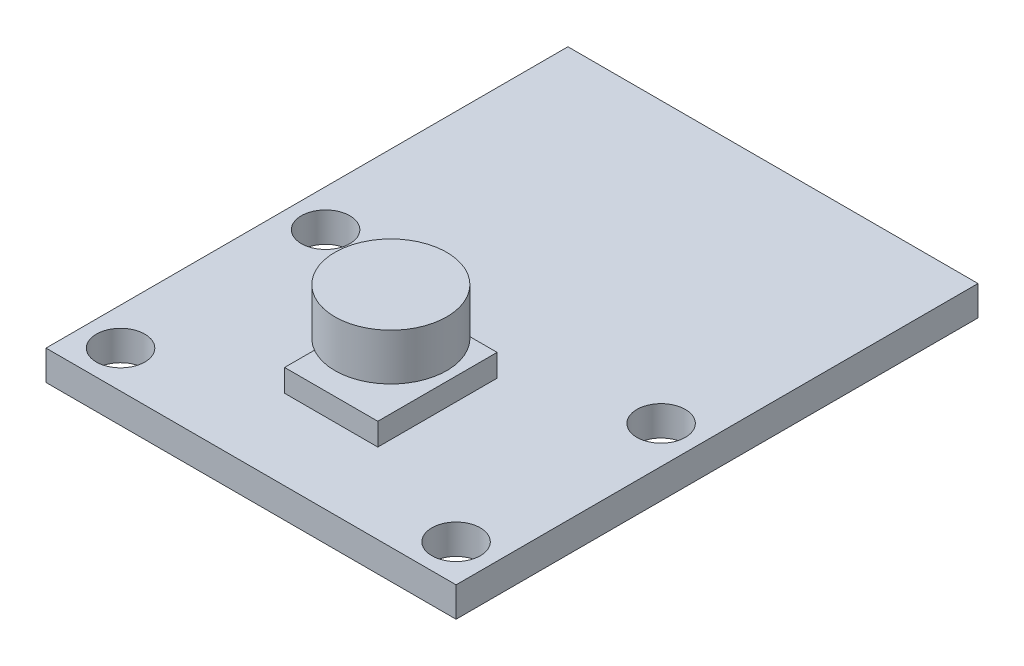
ISO-10303-21;
HEADER;
FILE_DESCRIPTION(('STEP AP214'),'2;1');
FILE_NAME('part.step','',(''),(''),'','','');
FILE_SCHEMA(('AUTOMOTIVE_DESIGN { 1 0 10303 214 1 1 1 1 }'));
ENDSEC;
DATA;
#1=APPLICATION_CONTEXT('core data for automotive mechanical design processes');
#2=APPLICATION_PROTOCOL_DEFINITION('international standard','automotive_design',2000,#1);
#3=PRODUCT_CONTEXT('',#1,'mechanical');
#4=PRODUCT('Part','Part','',(#3));
#5=PRODUCT_RELATED_PRODUCT_CATEGORY('part','',(#4));
#6=PRODUCT_DEFINITION_FORMATION('','',#4);
#7=PRODUCT_DEFINITION_CONTEXT('part definition',#1,'design');
#8=PRODUCT_DEFINITION('design','',#6,#7);
#9=PRODUCT_DEFINITION_SHAPE('','',#8);
#10=(LENGTH_UNIT() NAMED_UNIT(*) SI_UNIT(.MILLI.,.METRE.));
#11=(NAMED_UNIT(*) PLANE_ANGLE_UNIT() SI_UNIT($,.RADIAN.));
#12=(NAMED_UNIT(*) SI_UNIT($,.STERADIAN.) SOLID_ANGLE_UNIT());
#13=UNCERTAINTY_MEASURE_WITH_UNIT(LENGTH_MEASURE(1.E-05),#10,'distance_accuracy_value','');
#14=(GEOMETRIC_REPRESENTATION_CONTEXT(3) GLOBAL_UNCERTAINTY_ASSIGNED_CONTEXT((#13)) GLOBAL_UNIT_ASSIGNED_CONTEXT((#10,
#11,#12)) REPRESENTATION_CONTEXT('',''));
#15=CARTESIAN_POINT('',(0.,0.,0.));
#16=DIRECTION('',(0.,0.,1.));
#17=DIRECTION('',(1.,0.,0.));
#18=AXIS2_PLACEMENT_3D('',#15,#16,#17);
#19=CARTESIAN_POINT('',(0.,6.3,0.));
#20=DIRECTION('',(0.,-1.,0.));
#21=DIRECTION('',(0.,0.,-1.));
#22=AXIS2_PLACEMENT_3D('',#19,#20,#21);
#23=CYLINDRICAL_SURFACE('',#22,3.);
#24=CARTESIAN_POINT('',(0.,6.3,0.));
#25=DIRECTION('',(0.,1.,0.));
#26=DIRECTION('',(0.,0.,1.));
#27=AXIS2_PLACEMENT_3D('',#24,#25,#26);
#28=CIRCLE('',#27,3.);
#29=CARTESIAN_POINT('',(0.,6.3,3.));
#30=VERTEX_POINT('',#29);
#31=EDGE_CURVE('E11',#30,#30,#28,.T.);
#32=ORIENTED_EDGE('',*,*,#31,.F.);
#33=EDGE_LOOP('',(#32));
#34=FACE_BOUND('',#33,.T.);
#35=CARTESIAN_POINT('',(0.,3.8,0.));
#36=DIRECTION('',(0.,1.,0.));
#37=DIRECTION('',(0.,0.,1.));
#38=AXIS2_PLACEMENT_3D('',#35,#36,#37);
#39=CIRCLE('',#38,3.);
#40=CARTESIAN_POINT('',(0.,3.8,3.));
#41=VERTEX_POINT('',#40);
#42=EDGE_CURVE('E43',#41,#41,#39,.T.);
#43=ORIENTED_EDGE('',*,*,#42,.T.);
#44=EDGE_LOOP('',(#43));
#45=FACE_BOUND('',#44,.T.);
#46=ADVANCED_FACE('F40',(#34,#45),#23,.T.);
#47=CARTESIAN_POINT('',(0.,6.3,0.));
#48=DIRECTION('',(0.,1.,0.));
#49=DIRECTION('',(0.,0.,1.));
#50=AXIS2_PLACEMENT_3D('',#47,#48,#49);
#51=PLANE('',#50);
#52=ORIENTED_EDGE('',*,*,#31,.T.);
#53=EDGE_LOOP('',(#52));
#54=FACE_BOUND('',#53,.T.);
#55=ADVANCED_FACE('F55',(#54),#51,.T.);
#56=CARTESIAN_POINT('',(0.,3.8,0.));
#57=DIRECTION('',(0.,1.,0.));
#58=DIRECTION('',(0.,0.,1.));
#59=AXIS2_PLACEMENT_3D('',#56,#57,#58);
#60=PLANE('',#59);
#61=ORIENTED_EDGE('',*,*,#42,.F.);
#62=EDGE_LOOP('',(#61));
#63=FACE_BOUND('',#62,.T.);
#64=ADVANCED_FACE('F53',(#63),#60,.F.);
#65=CLOSED_SHELL('',(#46,#55,#64));
#66=MANIFOLD_SOLID_BREP('B2',#65);
#67=CARTESIAN_POINT('',(0.,1.6,0.));
#68=DIRECTION('',(0.,1.,0.));
#69=DIRECTION('',(0.,0.,1.));
#70=AXIS2_PLACEMENT_3D('',#67,#68,#69);
#71=PLANE('',#70);
#72=CARTESIAN_POINT('',(9.,1.6,5.5));
#73=DIRECTION('',(0.,1.,0.));
#74=DIRECTION('',(0.,0.,1.));
#75=AXIS2_PLACEMENT_3D('',#72,#73,#74);
#76=CIRCLE('',#75,1.3);
#77=CARTESIAN_POINT('',(9.,1.6,6.8));
#78=VERTEX_POINT('',#77);
#79=EDGE_CURVE('E190',#78,#78,#76,.T.);
#80=ORIENTED_EDGE('',*,*,#79,.F.);
#81=EDGE_LOOP('',(#80));
#82=FACE_BOUND('',#81,.T.);
#83=CARTESIAN_POINT('',(-9.,1.6,-5.5));
#84=DIRECTION('',(0.,1.,0.));
#85=DIRECTION('',(0.,0.,1.));
#86=AXIS2_PLACEMENT_3D('',#83,#84,#85);
#87=CIRCLE('',#86,1.3);
#88=CARTESIAN_POINT('',(-9.,1.6,-4.2));
#89=VERTEX_POINT('',#88);
#90=EDGE_CURVE('E202',#89,#89,#87,.T.);
#91=ORIENTED_EDGE('',*,*,#90,.F.);
#92=EDGE_LOOP('',(#91));
#93=FACE_BOUND('',#92,.T.);
#94=DIRECTION('',(0.,0.,1.));
#95=VECTOR('',#94,1.);
#96=CARTESIAN_POINT('',(-11.,1.6,-20.5));
#97=LINE('',#96,#95);
#98=CARTESIAN_POINT('',(-11.,1.6,-20.5));
#99=VERTEX_POINT('',#98);
#100=CARTESIAN_POINT('',(-11.,1.6,7.5));
#101=VERTEX_POINT('',#100);
#102=EDGE_CURVE('E208',#99,#101,#97,.T.);
#103=ORIENTED_EDGE('',*,*,#102,.T.);
#104=DIRECTION('',(1.,0.,0.));
#105=VECTOR('',#104,1.);
#106=CARTESIAN_POINT('',(-11.,1.6,7.5));
#107=LINE('',#106,#105);
#108=CARTESIAN_POINT('',(11.,1.6,7.5));
#109=VERTEX_POINT('',#108);
#110=EDGE_CURVE('E132',#101,#109,#107,.T.);
#111=ORIENTED_EDGE('',*,*,#110,.T.);
#112=DIRECTION('',(0.,0.,-1.));
#113=VECTOR('',#112,1.);
#114=CARTESIAN_POINT('',(11.,1.6,-20.5));
#115=LINE('',#114,#113);
#116=CARTESIAN_POINT('',(11.,1.6,-20.5));
#117=VERTEX_POINT('',#116);
#118=EDGE_CURVE('E211',#109,#117,#115,.T.);
#119=ORIENTED_EDGE('',*,*,#118,.T.);
#120=DIRECTION('',(-1.,0.,0.));
#121=VECTOR('',#120,1.);
#122=CARTESIAN_POINT('',(-11.,1.6,-20.5));
#123=LINE('',#122,#121);
#124=EDGE_CURVE('E104',#117,#99,#123,.T.);
#125=ORIENTED_EDGE('',*,*,#124,.T.);
#126=EDGE_LOOP('',(#103,#111,#119,#125));
#127=FACE_BOUND('',#126,.T.);
#128=CARTESIAN_POINT('',(9.,1.6,-5.5));
#129=DIRECTION('',(0.,1.,0.));
#130=DIRECTION('',(0.,0.,1.));
#131=AXIS2_PLACEMENT_3D('',#128,#129,#130);
#132=CIRCLE('',#131,1.3);
#133=CARTESIAN_POINT('',(9.,1.6,-4.2));
#134=VERTEX_POINT('',#133);
#135=EDGE_CURVE('E196',#134,#134,#132,.T.);
#136=ORIENTED_EDGE('',*,*,#135,.F.);
#137=EDGE_LOOP('',(#136));
#138=FACE_BOUND('',#137,.T.);
#139=CARTESIAN_POINT('',(-9.,1.6,5.5));
#140=DIRECTION('',(0.,1.,0.));
#141=DIRECTION('',(0.,0.,1.));
#142=AXIS2_PLACEMENT_3D('',#139,#140,#141);
#143=CIRCLE('',#142,1.3);
#144=CARTESIAN_POINT('',(-9.,1.6,6.8));
#145=VERTEX_POINT('',#144);
#146=EDGE_CURVE('E182',#145,#145,#143,.T.);
#147=ORIENTED_EDGE('',*,*,#146,.F.);
#148=EDGE_LOOP('',(#147));
#149=FACE_BOUND('',#148,.T.);
#150=DIRECTION('',(1.,0.,0.));
#151=VECTOR('',#150,1.);
#152=CARTESIAN_POINT('',(-2.5,1.6,3.2));
#153=LINE('',#152,#151);
#154=CARTESIAN_POINT('',(-2.5,1.6,3.2));
#155=VERTEX_POINT('',#154);
#156=CARTESIAN_POINT('',(2.5,1.6,3.2));
#157=VERTEX_POINT('',#156);
#158=EDGE_CURVE('E378',#155,#157,#153,.T.);
#159=ORIENTED_EDGE('',*,*,#158,.F.);
#160=DIRECTION('',(0.,0.,1.));
#161=VECTOR('',#160,1.);
#162=CARTESIAN_POINT('',(-2.5,1.6,-3.2));
#163=LINE('',#162,#161);
#164=CARTESIAN_POINT('',(-2.5,1.6,-3.2));
#165=VERTEX_POINT('',#164);
#166=EDGE_CURVE('E177',#165,#155,#163,.T.);
#167=ORIENTED_EDGE('',*,*,#166,.F.);
#168=DIRECTION('',(-1.,0.,0.));
#169=VECTOR('',#168,1.);
#170=CARTESIAN_POINT('',(-2.5,1.6,-3.2));
#171=LINE('',#170,#169);
#172=CARTESIAN_POINT('',(2.5,1.6,-3.2));
#173=VERTEX_POINT('',#172);
#174=EDGE_CURVE('E173',#173,#165,#171,.T.);
#175=ORIENTED_EDGE('',*,*,#174,.F.);
#176=DIRECTION('',(0.,0.,-1.));
#177=VECTOR('',#176,1.);
#178=CARTESIAN_POINT('',(2.5,1.6,-3.2));
#179=LINE('',#178,#177);
#180=EDGE_CURVE('E375',#157,#173,#179,.T.);
#181=ORIENTED_EDGE('',*,*,#180,.F.);
#182=EDGE_LOOP('',(#159,#167,#175,#181));
#183=FACE_BOUND('',#182,.T.);
#184=ADVANCED_FACE('F80',(#82,#93,#127,#138,#149,#183),#71,.T.);
#185=CARTESIAN_POINT('',(0.,0.,0.));
#186=DIRECTION('',(0.,1.,0.));
#187=DIRECTION('',(0.,0.,1.));
#188=AXIS2_PLACEMENT_3D('',#185,#186,#187);
#189=PLANE('',#188);
#190=DIRECTION('',(0.,0.,1.));
#191=VECTOR('',#190,1.);
#192=CARTESIAN_POINT('',(-11.,0.,-20.5));
#193=LINE('',#192,#191);
#194=CARTESIAN_POINT('',(-11.,0.,-20.5));
#195=VERTEX_POINT('',#194);
#196=CARTESIAN_POINT('',(-11.,0.,7.5));
#197=VERTEX_POINT('',#196);
#198=EDGE_CURVE('E205',#195,#197,#193,.T.);
#199=ORIENTED_EDGE('',*,*,#198,.F.);
#200=DIRECTION('',(-1.,0.,0.));
#201=VECTOR('',#200,1.);
#202=CARTESIAN_POINT('',(-11.,0.,-20.5));
#203=LINE('',#202,#201);
#204=CARTESIAN_POINT('',(11.,0.,-20.5));
#205=VERTEX_POINT('',#204);
#206=EDGE_CURVE('E125',#205,#195,#203,.T.);
#207=ORIENTED_EDGE('',*,*,#206,.F.);
#208=DIRECTION('',(0.,0.,-1.));
#209=VECTOR('',#208,1.);
#210=CARTESIAN_POINT('',(11.,0.,-20.5));
#211=LINE('',#210,#209);
#212=CARTESIAN_POINT('',(11.,0.,7.5));
#213=VERTEX_POINT('',#212);
#214=EDGE_CURVE('E219',#213,#205,#211,.T.);
#215=ORIENTED_EDGE('',*,*,#214,.F.);
#216=DIRECTION('',(1.,0.,0.));
#217=VECTOR('',#216,1.);
#218=CARTESIAN_POINT('',(-11.,0.,7.5));
#219=LINE('',#218,#217);
#220=EDGE_CURVE('E217',#197,#213,#219,.T.);
#221=ORIENTED_EDGE('',*,*,#220,.F.);
#222=EDGE_LOOP('',(#199,#207,#215,#221));
#223=FACE_BOUND('',#222,.T.);
#224=CARTESIAN_POINT('',(-9.,0.,-5.5));
#225=DIRECTION('',(0.,1.,0.));
#226=DIRECTION('',(0.,0.,1.));
#227=AXIS2_PLACEMENT_3D('',#224,#225,#226);
#228=CIRCLE('',#227,1.3);
#229=CARTESIAN_POINT('',(-9.,0.,-4.2));
#230=VERTEX_POINT('',#229);
#231=EDGE_CURVE('E199',#230,#230,#228,.T.);
#232=ORIENTED_EDGE('',*,*,#231,.T.);
#233=EDGE_LOOP('',(#232));
#234=FACE_BOUND('',#233,.T.);
#235=CARTESIAN_POINT('',(9.,0.,-5.5));
#236=DIRECTION('',(0.,1.,0.));
#237=DIRECTION('',(0.,0.,1.));
#238=AXIS2_PLACEMENT_3D('',#235,#236,#237);
#239=CIRCLE('',#238,1.3);
#240=CARTESIAN_POINT('',(9.,0.,-4.2));
#241=VERTEX_POINT('',#240);
#242=EDGE_CURVE('E193',#241,#241,#239,.T.);
#243=ORIENTED_EDGE('',*,*,#242,.T.);
#244=EDGE_LOOP('',(#243));
#245=FACE_BOUND('',#244,.T.);
#246=CARTESIAN_POINT('',(9.,0.,5.5));
#247=DIRECTION('',(0.,1.,0.));
#248=DIRECTION('',(0.,0.,1.));
#249=AXIS2_PLACEMENT_3D('',#246,#247,#248);
#250=CIRCLE('',#249,1.3);
#251=CARTESIAN_POINT('',(9.,0.,6.8));
#252=VERTEX_POINT('',#251);
#253=EDGE_CURVE('E188',#252,#252,#250,.T.);
#254=ORIENTED_EDGE('',*,*,#253,.T.);
#255=EDGE_LOOP('',(#254));
#256=FACE_BOUND('',#255,.T.);
#257=CARTESIAN_POINT('',(-9.,0.,5.5));
#258=DIRECTION('',(0.,1.,0.));
#259=DIRECTION('',(0.,0.,1.));
#260=AXIS2_PLACEMENT_3D('',#257,#258,#259);
#261=CIRCLE('',#260,1.3);
#262=CARTESIAN_POINT('',(-9.,0.,6.8));
#263=VERTEX_POINT('',#262);
#264=EDGE_CURVE('E179',#263,#263,#261,.T.);
#265=ORIENTED_EDGE('',*,*,#264,.T.);
#266=EDGE_LOOP('',(#265));
#267=FACE_BOUND('',#266,.T.);
#268=ADVANCED_FACE('F232',(#223,#234,#245,#256,#267),#189,.F.);
#269=CARTESIAN_POINT('',(-11.,1.6,-20.5));
#270=DIRECTION('',(1.,0.,0.));
#271=DIRECTION('',(0.,0.,-1.));
#272=AXIS2_PLACEMENT_3D('',#269,#270,#271);
#273=PLANE('',#272);
#274=ORIENTED_EDGE('',*,*,#198,.T.);
#275=DIRECTION('',(0.,-1.,0.));
#276=VECTOR('',#275,1.);
#277=CARTESIAN_POINT('',(-11.,1.6,7.5));
#278=LINE('',#277,#276);
#279=EDGE_CURVE('E38',#101,#197,#278,.T.);
#280=ORIENTED_EDGE('',*,*,#279,.F.);
#281=ORIENTED_EDGE('',*,*,#102,.F.);
#282=DIRECTION('',(0.,-1.,0.));
#283=VECTOR('',#282,1.);
#284=CARTESIAN_POINT('',(-11.,1.6,-20.5));
#285=LINE('',#284,#283);
#286=EDGE_CURVE('E214',#99,#195,#285,.T.);
#287=ORIENTED_EDGE('',*,*,#286,.T.);
#288=EDGE_LOOP('',(#274,#280,#281,#287));
#289=FACE_BOUND('',#288,.T.);
#290=ADVANCED_FACE('F82',(#289),#273,.F.);
#291=CARTESIAN_POINT('',(-11.,1.6,7.5));
#292=DIRECTION('',(0.,0.,-1.));
#293=DIRECTION('',(-1.,0.,0.));
#294=AXIS2_PLACEMENT_3D('',#291,#292,#293);
#295=PLANE('',#294);
#296=ORIENTED_EDGE('',*,*,#220,.T.);
#297=DIRECTION('',(0.,-1.,0.));
#298=VECTOR('',#297,1.);
#299=CARTESIAN_POINT('',(11.,1.6,7.5));
#300=LINE('',#299,#298);
#301=EDGE_CURVE('E88',#109,#213,#300,.T.);
#302=ORIENTED_EDGE('',*,*,#301,.F.);
#303=ORIENTED_EDGE('',*,*,#110,.F.);
#304=ORIENTED_EDGE('',*,*,#279,.T.);
#305=EDGE_LOOP('',(#296,#302,#303,#304));
#306=FACE_BOUND('',#305,.T.);
#307=ADVANCED_FACE('F248',(#306),#295,.F.);
#308=CARTESIAN_POINT('',(11.,1.6,-20.5));
#309=DIRECTION('',(-1.,0.,0.));
#310=DIRECTION('',(0.,0.,1.));
#311=AXIS2_PLACEMENT_3D('',#308,#309,#310);
#312=PLANE('',#311);
#313=ORIENTED_EDGE('',*,*,#214,.T.);
#314=DIRECTION('',(0.,-1.,0.));
#315=VECTOR('',#314,1.);
#316=CARTESIAN_POINT('',(11.,1.6,-20.5));
#317=LINE('',#316,#315);
#318=EDGE_CURVE('E223',#117,#205,#317,.T.);
#319=ORIENTED_EDGE('',*,*,#318,.F.);
#320=ORIENTED_EDGE('',*,*,#118,.F.);
#321=ORIENTED_EDGE('',*,*,#301,.T.);
#322=EDGE_LOOP('',(#313,#319,#320,#321));
#323=FACE_BOUND('',#322,.T.);
#324=ADVANCED_FACE('F228',(#323),#312,.F.);
#325=CARTESIAN_POINT('',(-11.,1.6,-20.5));
#326=DIRECTION('',(0.,0.,1.));
#327=DIRECTION('',(1.,0.,0.));
#328=AXIS2_PLACEMENT_3D('',#325,#326,#327);
#329=PLANE('',#328);
#330=ORIENTED_EDGE('',*,*,#206,.T.);
#331=ORIENTED_EDGE('',*,*,#286,.F.);
#332=ORIENTED_EDGE('',*,*,#124,.F.);
#333=ORIENTED_EDGE('',*,*,#318,.T.);
#334=EDGE_LOOP('',(#330,#331,#332,#333));
#335=FACE_BOUND('',#334,.T.);
#336=ADVANCED_FACE('F237',(#335),#329,.F.);
#337=CARTESIAN_POINT('',(-9.,1.6,-5.5));
#338=DIRECTION('',(0.,-1.,0.));
#339=DIRECTION('',(0.,0.,-1.));
#340=AXIS2_PLACEMENT_3D('',#337,#338,#339);
#341=CYLINDRICAL_SURFACE('',#340,1.3);
#342=ORIENTED_EDGE('',*,*,#90,.T.);
#343=EDGE_LOOP('',(#342));
#344=FACE_BOUND('',#343,.T.);
#345=ORIENTED_EDGE('',*,*,#231,.F.);
#346=EDGE_LOOP('',(#345));
#347=FACE_BOUND('',#346,.T.);
#348=ADVANCED_FACE('F239',(#344,#347),#341,.F.);
#349=CARTESIAN_POINT('',(9.,1.6,-5.5));
#350=DIRECTION('',(0.,-1.,0.));
#351=DIRECTION('',(0.,0.,-1.));
#352=AXIS2_PLACEMENT_3D('',#349,#350,#351);
#353=CYLINDRICAL_SURFACE('',#352,1.3);
#354=ORIENTED_EDGE('',*,*,#135,.T.);
#355=EDGE_LOOP('',(#354));
#356=FACE_BOUND('',#355,.T.);
#357=ORIENTED_EDGE('',*,*,#242,.F.);
#358=EDGE_LOOP('',(#357));
#359=FACE_BOUND('',#358,.T.);
#360=ADVANCED_FACE('F245',(#356,#359),#353,.F.);
#361=CARTESIAN_POINT('',(9.,1.6,5.5));
#362=DIRECTION('',(0.,-1.,0.));
#363=DIRECTION('',(0.,0.,-1.));
#364=AXIS2_PLACEMENT_3D('',#361,#362,#363);
#365=CYLINDRICAL_SURFACE('',#364,1.3);
#366=ORIENTED_EDGE('',*,*,#79,.T.);
#367=EDGE_LOOP('',(#366));
#368=FACE_BOUND('',#367,.T.);
#369=ORIENTED_EDGE('',*,*,#253,.F.);
#370=EDGE_LOOP('',(#369));
#371=FACE_BOUND('',#370,.T.);
#372=ADVANCED_FACE('F262',(#368,#371),#365,.F.);
#373=CARTESIAN_POINT('',(-9.,1.6,5.5));
#374=DIRECTION('',(0.,-1.,0.));
#375=DIRECTION('',(0.,0.,-1.));
#376=AXIS2_PLACEMENT_3D('',#373,#374,#375);
#377=CYLINDRICAL_SURFACE('',#376,1.3);
#378=ORIENTED_EDGE('',*,*,#146,.T.);
#379=EDGE_LOOP('',(#378));
#380=FACE_BOUND('',#379,.T.);
#381=ORIENTED_EDGE('',*,*,#264,.F.);
#382=EDGE_LOOP('',(#381));
#383=FACE_BOUND('',#382,.T.);
#384=ADVANCED_FACE('F266',(#380,#383),#377,.F.);
#385=CARTESIAN_POINT('',(-2.5,2.8,-3.2));
#386=DIRECTION('',(1.,0.,0.));
#387=DIRECTION('',(0.,0.,-1.));
#388=AXIS2_PLACEMENT_3D('',#385,#386,#387);
#389=PLANE('',#388);
#390=ORIENTED_EDGE('',*,*,#166,.T.);
#391=DIRECTION('',(0.,-1.,0.));
#392=VECTOR('',#391,1.);
#393=CARTESIAN_POINT('',(-2.5,2.8,3.2));
#394=LINE('',#393,#392);
#395=CARTESIAN_POINT('',(-2.5,2.8,3.2));
#396=VERTEX_POINT('',#395);
#397=EDGE_CURVE('E158',#396,#155,#394,.T.);
#398=ORIENTED_EDGE('',*,*,#397,.F.);
#399=DIRECTION('',(0.,0.,1.));
#400=VECTOR('',#399,1.);
#401=CARTESIAN_POINT('',(-2.5,2.8,-3.2));
#402=LINE('',#401,#400);
#403=CARTESIAN_POINT('',(-2.5,2.8,-3.2));
#404=VERTEX_POINT('',#403);
#405=EDGE_CURVE('E165',#404,#396,#402,.T.);
#406=ORIENTED_EDGE('',*,*,#405,.F.);
#407=DIRECTION('',(0.,-1.,0.));
#408=VECTOR('',#407,1.);
#409=CARTESIAN_POINT('',(-2.5,2.8,-3.2));
#410=LINE('',#409,#408);
#411=EDGE_CURVE('E372',#404,#165,#410,.T.);
#412=ORIENTED_EDGE('',*,*,#411,.T.);
#413=EDGE_LOOP('',(#390,#398,#406,#412));
#414=FACE_BOUND('',#413,.T.);
#415=ADVANCED_FACE('F175',(#414),#389,.F.);
#416=CARTESIAN_POINT('',(-2.5,2.8,3.2));
#417=DIRECTION('',(0.,0.,-1.));
#418=DIRECTION('',(-1.,0.,0.));
#419=AXIS2_PLACEMENT_3D('',#416,#417,#418);
#420=PLANE('',#419);
#421=ORIENTED_EDGE('',*,*,#158,.T.);
#422=DIRECTION('',(0.,-1.,0.));
#423=VECTOR('',#422,1.);
#424=CARTESIAN_POINT('',(2.5,2.8,3.2));
#425=LINE('',#424,#423);
#426=CARTESIAN_POINT('',(2.5,2.8,3.2));
#427=VERTEX_POINT('',#426);
#428=EDGE_CURVE('E161',#427,#157,#425,.T.);
#429=ORIENTED_EDGE('',*,*,#428,.F.);
#430=DIRECTION('',(1.,0.,0.));
#431=VECTOR('',#430,1.);
#432=CARTESIAN_POINT('',(-2.5,2.8,3.2));
#433=LINE('',#432,#431);
#434=EDGE_CURVE('E154',#396,#427,#433,.T.);
#435=ORIENTED_EDGE('',*,*,#434,.F.);
#436=ORIENTED_EDGE('',*,*,#397,.T.);
#437=EDGE_LOOP('',(#421,#429,#435,#436));
#438=FACE_BOUND('',#437,.T.);
#439=ADVANCED_FACE('F156',(#438),#420,.F.);
#440=CARTESIAN_POINT('',(2.5,2.8,-3.2));
#441=DIRECTION('',(-1.,0.,0.));
#442=DIRECTION('',(0.,0.,1.));
#443=AXIS2_PLACEMENT_3D('',#440,#441,#442);
#444=PLANE('',#443);
#445=ORIENTED_EDGE('',*,*,#180,.T.);
#446=DIRECTION('',(0.,-1.,0.));
#447=VECTOR('',#446,1.);
#448=CARTESIAN_POINT('',(2.5,2.8,-3.2));
#449=LINE('',#448,#447);
#450=CARTESIAN_POINT('',(2.5,2.8,-3.2));
#451=VERTEX_POINT('',#450);
#452=EDGE_CURVE('E95',#451,#173,#449,.T.);
#453=ORIENTED_EDGE('',*,*,#452,.F.);
#454=DIRECTION('',(0.,0.,-1.));
#455=VECTOR('',#454,1.);
#456=CARTESIAN_POINT('',(2.5,2.8,-3.2));
#457=LINE('',#456,#455);
#458=EDGE_CURVE('E164',#427,#451,#457,.T.);
#459=ORIENTED_EDGE('',*,*,#458,.F.);
#460=ORIENTED_EDGE('',*,*,#428,.T.);
#461=EDGE_LOOP('',(#445,#453,#459,#460));
#462=FACE_BOUND('',#461,.T.);
#463=ADVANCED_FACE('F275',(#462),#444,.F.);
#464=CARTESIAN_POINT('',(-2.5,2.8,-3.2));
#465=DIRECTION('',(0.,0.,1.));
#466=DIRECTION('',(1.,0.,0.));
#467=AXIS2_PLACEMENT_3D('',#464,#465,#466);
#468=PLANE('',#467);
#469=ORIENTED_EDGE('',*,*,#174,.T.);
#470=ORIENTED_EDGE('',*,*,#411,.F.);
#471=DIRECTION('',(-1.,0.,0.));
#472=VECTOR('',#471,1.);
#473=CARTESIAN_POINT('',(-2.5,2.8,-3.2));
#474=LINE('',#473,#472);
#475=EDGE_CURVE('E169',#451,#404,#474,.T.);
#476=ORIENTED_EDGE('',*,*,#475,.F.);
#477=ORIENTED_EDGE('',*,*,#452,.T.);
#478=EDGE_LOOP('',(#469,#470,#476,#477));
#479=FACE_BOUND('',#478,.T.);
#480=ADVANCED_FACE('F278',(#479),#468,.F.);
#481=CARTESIAN_POINT('',(0.,2.8,0.));
#482=DIRECTION('',(0.,1.,0.));
#483=DIRECTION('',(0.,0.,1.));
#484=AXIS2_PLACEMENT_3D('',#481,#482,#483);
#485=PLANE('',#484);
#486=ORIENTED_EDGE('',*,*,#405,.T.);
#487=ORIENTED_EDGE('',*,*,#434,.T.);
#488=ORIENTED_EDGE('',*,*,#458,.T.);
#489=ORIENTED_EDGE('',*,*,#475,.T.);
#490=EDGE_LOOP('',(#486,#487,#488,#489));
#491=FACE_BOUND('',#490,.T.);
#492=ADVANCED_FACE('F168',(#491),#485,.T.);
#493=CLOSED_SHELL('',(#184,#268,#290,#307,#324,#336,#348,#360,#372,#384,#415,#439,#463,#480,#492));
#494=MANIFOLD_SOLID_BREP('B6',#493);
#495=ADVANCED_BREP_SHAPE_REPRESENTATION('',(#18,#66,#494),#14);
#496=SHAPE_DEFINITION_REPRESENTATION(#9,#495);
ENDSEC;
END-ISO-10303-21;
